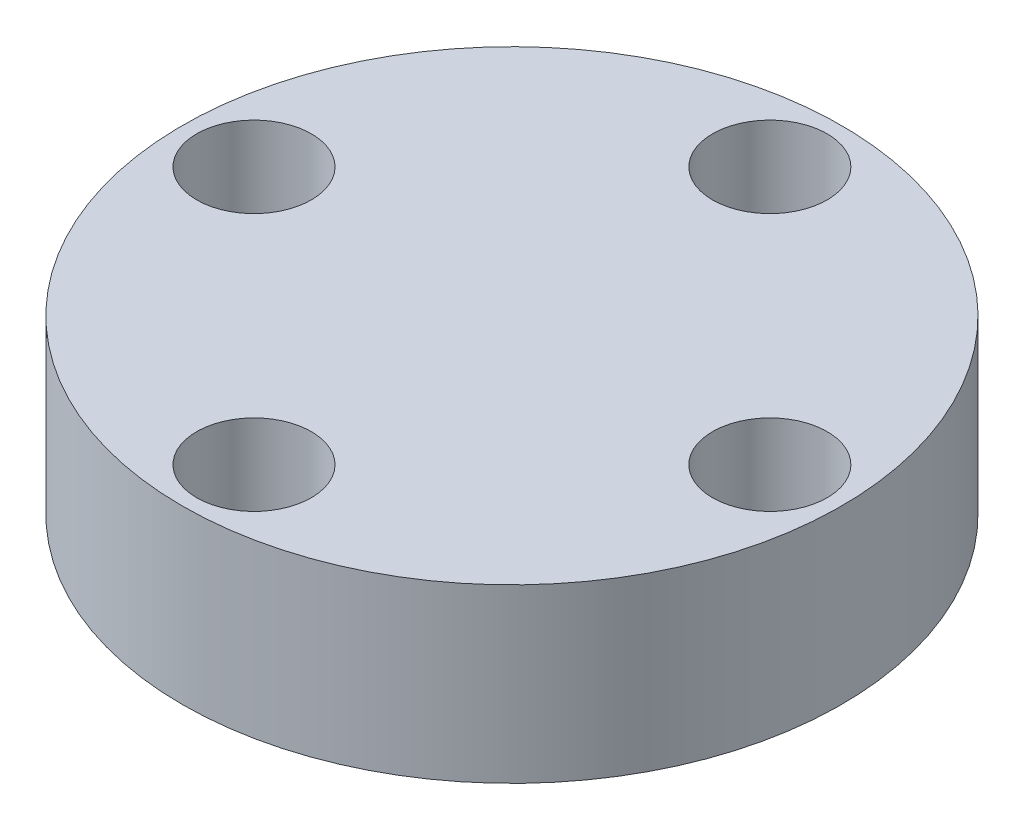
ISO-10303-21;
HEADER;
FILE_DESCRIPTION(('STEP AP214'),'2;1');
FILE_NAME('part.step','',(''),(''),'','','');
FILE_SCHEMA(('AUTOMOTIVE_DESIGN { 1 0 10303 214 1 1 1 1 }'));
ENDSEC;
DATA;
#1=APPLICATION_CONTEXT('core data for automotive mechanical design processes');
#2=APPLICATION_PROTOCOL_DEFINITION('international standard','automotive_design',2000,#1);
#3=PRODUCT_CONTEXT('',#1,'mechanical');
#4=PRODUCT('Part','Part','',(#3));
#5=PRODUCT_RELATED_PRODUCT_CATEGORY('part','',(#4));
#6=PRODUCT_DEFINITION_FORMATION('','',#4);
#7=PRODUCT_DEFINITION_CONTEXT('part definition',#1,'design');
#8=PRODUCT_DEFINITION('design','',#6,#7);
#9=PRODUCT_DEFINITION_SHAPE('','',#8);
#10=(LENGTH_UNIT() NAMED_UNIT(*) SI_UNIT(.MILLI.,.METRE.));
#11=(NAMED_UNIT(*) PLANE_ANGLE_UNIT() SI_UNIT($,.RADIAN.));
#12=(NAMED_UNIT(*) SI_UNIT($,.STERADIAN.) SOLID_ANGLE_UNIT());
#13=UNCERTAINTY_MEASURE_WITH_UNIT(LENGTH_MEASURE(1.E-05),#10,'distance_accuracy_value','');
#14=(GEOMETRIC_REPRESENTATION_CONTEXT(3) GLOBAL_UNCERTAINTY_ASSIGNED_CONTEXT((#13)) GLOBAL_UNIT_ASSIGNED_CONTEXT((#10,
#11,#12)) REPRESENTATION_CONTEXT('',''));
#15=CARTESIAN_POINT('',(0.,0.,0.));
#16=DIRECTION('',(0.,0.,1.));
#17=DIRECTION('',(1.,0.,0.));
#18=AXIS2_PLACEMENT_3D('',#15,#16,#17);
#19=CARTESIAN_POINT('',(0.,3.,0.));
#20=DIRECTION('',(0.,-1.,0.));
#21=DIRECTION('',(0.,0.,-1.));
#22=AXIS2_PLACEMENT_3D('',#19,#20,#21);
#23=CYLINDRICAL_SURFACE('',#22,5.75);
#24=CARTESIAN_POINT('',(0.,3.,0.));
#25=DIRECTION('',(0.,1.,0.));
#26=DIRECTION('',(0.,0.,1.));
#27=AXIS2_PLACEMENT_3D('',#24,#25,#26);
#28=CIRCLE('',#27,5.75);
#29=CARTESIAN_POINT('',(0.,3.,5.75));
#30=VERTEX_POINT('',#29);
#31=EDGE_CURVE('E10',#30,#30,#28,.T.);
#32=ORIENTED_EDGE('',*,*,#31,.F.);
#33=EDGE_LOOP('',(#32));
#34=FACE_BOUND('',#33,.T.);
#35=CARTESIAN_POINT('',(0.,0.,0.));
#36=DIRECTION('',(0.,1.,0.));
#37=DIRECTION('',(0.,0.,1.));
#38=AXIS2_PLACEMENT_3D('',#35,#36,#37);
#39=CIRCLE('',#38,5.75);
#40=CARTESIAN_POINT('',(0.,0.,5.75));
#41=VERTEX_POINT('',#40);
#42=EDGE_CURVE('E37',#41,#41,#39,.T.);
#43=ORIENTED_EDGE('',*,*,#42,.T.);
#44=EDGE_LOOP('',(#43));
#45=FACE_BOUND('',#44,.T.);
#46=ADVANCED_FACE('F34',(#34,#45),#23,.T.);
#47=CARTESIAN_POINT('',(0.,3.,0.));
#48=DIRECTION('',(0.,1.,0.));
#49=DIRECTION('',(0.,0.,1.));
#50=AXIS2_PLACEMENT_3D('',#47,#48,#49);
#51=PLANE('',#50);
#52=CARTESIAN_POINT('',(0.,3.,-4.5));
#53=DIRECTION('',(0.,1.,0.));
#54=DIRECTION('',(0.,0.,1.));
#55=AXIS2_PLACEMENT_3D('',#52,#53,#54);
#56=CIRCLE('',#55,1.);
#57=CARTESIAN_POINT('',(0.,3.,-3.5));
#58=VERTEX_POINT('',#57);
#59=EDGE_CURVE('E64',#58,#58,#56,.T.);
#60=ORIENTED_EDGE('',*,*,#59,.F.);
#61=EDGE_LOOP('',(#60));
#62=FACE_BOUND('',#61,.T.);
#63=CARTESIAN_POINT('',(4.5,3.,0.));
#64=DIRECTION('',(0.,1.,0.));
#65=DIRECTION('',(0.,0.,1.));
#66=AXIS2_PLACEMENT_3D('',#63,#64,#65);
#67=CIRCLE('',#66,1.);
#68=CARTESIAN_POINT('',(4.5,3.,1.));
#69=VERTEX_POINT('',#68);
#70=EDGE_CURVE('E58',#69,#69,#67,.T.);
#71=ORIENTED_EDGE('',*,*,#70,.F.);
#72=EDGE_LOOP('',(#71));
#73=FACE_BOUND('',#72,.T.);
#74=CARTESIAN_POINT('',(0.,3.,4.5));
#75=DIRECTION('',(0.,1.,0.));
#76=DIRECTION('',(0.,0.,1.));
#77=AXIS2_PLACEMENT_3D('',#74,#75,#76);
#78=CIRCLE('',#77,1.);
#79=CARTESIAN_POINT('',(0.,3.,5.5));
#80=VERTEX_POINT('',#79);
#81=EDGE_CURVE('E52',#80,#80,#78,.T.);
#82=ORIENTED_EDGE('',*,*,#81,.F.);
#83=EDGE_LOOP('',(#82));
#84=FACE_BOUND('',#83,.T.);
#85=CARTESIAN_POINT('',(-4.5,3.,0.));
#86=DIRECTION('',(0.,1.,0.));
#87=DIRECTION('',(0.,0.,1.));
#88=AXIS2_PLACEMENT_3D('',#85,#86,#87);
#89=CIRCLE('',#88,1.);
#90=CARTESIAN_POINT('',(-4.5,3.,1.));
#91=VERTEX_POINT('',#90);
#92=EDGE_CURVE('E46',#91,#91,#89,.T.);
#93=ORIENTED_EDGE('',*,*,#92,.F.);
#94=EDGE_LOOP('',(#93));
#95=FACE_BOUND('',#94,.T.);
#96=ORIENTED_EDGE('',*,*,#31,.T.);
#97=EDGE_LOOP('',(#96));
#98=FACE_BOUND('',#97,.T.);
#99=ADVANCED_FACE('F80',(#62,#73,#84,#95,#98),#51,.T.);
#100=CARTESIAN_POINT('',(0.,0.,0.));
#101=DIRECTION('',(0.,1.,0.));
#102=DIRECTION('',(0.,0.,1.));
#103=AXIS2_PLACEMENT_3D('',#100,#101,#102);
#104=PLANE('',#103);
#105=CARTESIAN_POINT('',(0.,0.,-4.5));
#106=DIRECTION('',(0.,1.,0.));
#107=DIRECTION('',(0.,0.,1.));
#108=AXIS2_PLACEMENT_3D('',#105,#106,#107);
#109=CIRCLE('',#108,1.);
#110=CARTESIAN_POINT('',(0.,0.,-3.5));
#111=VERTEX_POINT('',#110);
#112=EDGE_CURVE('E44',#111,#111,#109,.T.);
#113=ORIENTED_EDGE('',*,*,#112,.T.);
#114=EDGE_LOOP('',(#113));
#115=FACE_BOUND('',#114,.T.);
#116=CARTESIAN_POINT('',(4.5,0.,0.));
#117=DIRECTION('',(0.,1.,0.));
#118=DIRECTION('',(0.,0.,1.));
#119=AXIS2_PLACEMENT_3D('',#116,#117,#118);
#120=CIRCLE('',#119,1.);
#121=CARTESIAN_POINT('',(4.5,0.,1.));
#122=VERTEX_POINT('',#121);
#123=EDGE_CURVE('E61',#122,#122,#120,.T.);
#124=ORIENTED_EDGE('',*,*,#123,.T.);
#125=EDGE_LOOP('',(#124));
#126=FACE_BOUND('',#125,.T.);
#127=CARTESIAN_POINT('',(0.,0.,4.5));
#128=DIRECTION('',(0.,1.,0.));
#129=DIRECTION('',(0.,0.,1.));
#130=AXIS2_PLACEMENT_3D('',#127,#128,#129);
#131=CIRCLE('',#130,1.);
#132=CARTESIAN_POINT('',(0.,0.,5.5));
#133=VERTEX_POINT('',#132);
#134=EDGE_CURVE('E55',#133,#133,#131,.T.);
#135=ORIENTED_EDGE('',*,*,#134,.T.);
#136=EDGE_LOOP('',(#135));
#137=FACE_BOUND('',#136,.T.);
#138=CARTESIAN_POINT('',(-4.5,0.,0.));
#139=DIRECTION('',(0.,1.,0.));
#140=DIRECTION('',(0.,0.,1.));
#141=AXIS2_PLACEMENT_3D('',#138,#139,#140);
#142=CIRCLE('',#141,1.);
#143=CARTESIAN_POINT('',(-4.5,0.,1.));
#144=VERTEX_POINT('',#143);
#145=EDGE_CURVE('E49',#144,#144,#142,.T.);
#146=ORIENTED_EDGE('',*,*,#145,.T.);
#147=EDGE_LOOP('',(#146));
#148=FACE_BOUND('',#147,.T.);
#149=ORIENTED_EDGE('',*,*,#42,.F.);
#150=EDGE_LOOP('',(#149));
#151=FACE_BOUND('',#150,.T.);
#152=ADVANCED_FACE('F70',(#115,#126,#137,#148,#151),#104,.F.);
#153=CARTESIAN_POINT('',(-4.5,0.,0.));
#154=DIRECTION('',(0.,1.,0.));
#155=DIRECTION('',(0.,0.,1.));
#156=AXIS2_PLACEMENT_3D('',#153,#154,#155);
#157=CYLINDRICAL_SURFACE('',#156,1.);
#158=ORIENTED_EDGE('',*,*,#145,.F.);
#159=EDGE_LOOP('',(#158));
#160=FACE_BOUND('',#159,.T.);
#161=ORIENTED_EDGE('',*,*,#92,.T.);
#162=EDGE_LOOP('',(#161));
#163=FACE_BOUND('',#162,.T.);
#164=ADVANCED_FACE('F90',(#160,#163),#157,.F.);
#165=CARTESIAN_POINT('',(0.,0.,4.5));
#166=DIRECTION('',(0.,1.,0.));
#167=DIRECTION('',(0.,0.,1.));
#168=AXIS2_PLACEMENT_3D('',#165,#166,#167);
#169=CYLINDRICAL_SURFACE('',#168,1.);
#170=ORIENTED_EDGE('',*,*,#134,.F.);
#171=EDGE_LOOP('',(#170));
#172=FACE_BOUND('',#171,.T.);
#173=ORIENTED_EDGE('',*,*,#81,.T.);
#174=EDGE_LOOP('',(#173));
#175=FACE_BOUND('',#174,.T.);
#176=ADVANCED_FACE('F92',(#172,#175),#169,.F.);
#177=CARTESIAN_POINT('',(4.5,0.,0.));
#178=DIRECTION('',(0.,1.,0.));
#179=DIRECTION('',(0.,0.,1.));
#180=AXIS2_PLACEMENT_3D('',#177,#178,#179);
#181=CYLINDRICAL_SURFACE('',#180,1.);
#182=ORIENTED_EDGE('',*,*,#123,.F.);
#183=EDGE_LOOP('',(#182));
#184=FACE_BOUND('',#183,.T.);
#185=ORIENTED_EDGE('',*,*,#70,.T.);
#186=EDGE_LOOP('',(#185));
#187=FACE_BOUND('',#186,.T.);
#188=ADVANCED_FACE('F76',(#184,#187),#181,.F.);
#189=CARTESIAN_POINT('',(0.,0.,-4.5));
#190=DIRECTION('',(0.,1.,0.));
#191=DIRECTION('',(0.,0.,1.));
#192=AXIS2_PLACEMENT_3D('',#189,#190,#191);
#193=CYLINDRICAL_SURFACE('',#192,1.);
#194=ORIENTED_EDGE('',*,*,#112,.F.);
#195=EDGE_LOOP('',(#194));
#196=FACE_BOUND('',#195,.T.);
#197=ORIENTED_EDGE('',*,*,#59,.T.);
#198=EDGE_LOOP('',(#197));
#199=FACE_BOUND('',#198,.T.);
#200=ADVANCED_FACE('F73',(#196,#199),#193,.F.);
#201=CLOSED_SHELL('',(#46,#99,#152,#164,#176,#188,#200));
#202=MANIFOLD_SOLID_BREP('B2',#201);
#203=ADVANCED_BREP_SHAPE_REPRESENTATION('',(#18,#202),#14);
#204=SHAPE_DEFINITION_REPRESENTATION(#9,#203);
ENDSEC;
END-ISO-10303-21;
